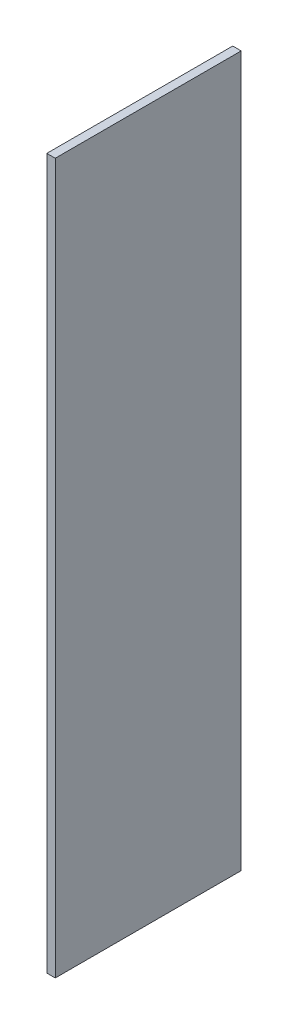
ISO-10303-21;
HEADER;
FILE_DESCRIPTION(('STEP AP214'),'2;1');
FILE_NAME('part.step','',(''),(''),'','','');
FILE_SCHEMA(('AUTOMOTIVE_DESIGN { 1 0 10303 214 1 1 1 1 }'));
ENDSEC;
DATA;
#1=APPLICATION_CONTEXT('core data for automotive mechanical design processes');
#2=APPLICATION_PROTOCOL_DEFINITION('international standard','automotive_design',2000,#1);
#3=PRODUCT_CONTEXT('',#1,'mechanical');
#4=PRODUCT('Part','Part','',(#3));
#5=PRODUCT_RELATED_PRODUCT_CATEGORY('part','',(#4));
#6=PRODUCT_DEFINITION_FORMATION('','',#4);
#7=PRODUCT_DEFINITION_CONTEXT('part definition',#1,'design');
#8=PRODUCT_DEFINITION('design','',#6,#7);
#9=PRODUCT_DEFINITION_SHAPE('','',#8);
#10=(LENGTH_UNIT() NAMED_UNIT(*) SI_UNIT(.MILLI.,.METRE.));
#11=(NAMED_UNIT(*) PLANE_ANGLE_UNIT() SI_UNIT($,.RADIAN.));
#12=(NAMED_UNIT(*) SI_UNIT($,.STERADIAN.) SOLID_ANGLE_UNIT());
#13=UNCERTAINTY_MEASURE_WITH_UNIT(LENGTH_MEASURE(1.E-05),#10,'distance_accuracy_value','');
#14=(GEOMETRIC_REPRESENTATION_CONTEXT(3) GLOBAL_UNCERTAINTY_ASSIGNED_CONTEXT((#13)) GLOBAL_UNIT_ASSIGNED_CONTEXT((#10,
#11,#12)) REPRESENTATION_CONTEXT('',''));
#15=CARTESIAN_POINT('',(0.,0.,0.));
#16=DIRECTION('',(0.,0.,1.));
#17=DIRECTION('',(1.,0.,0.));
#18=AXIS2_PLACEMENT_3D('',#15,#16,#17);
#19=CARTESIAN_POINT('',(12.7,2133.6,279.4));
#20=DIRECTION('',(-1.,0.,0.));
#21=DIRECTION('',(0.,0.,1.));
#22=AXIS2_PLACEMENT_3D('',#19,#20,#21);
#23=PLANE('',#22);
#24=DIRECTION('',(0.,0.,-1.));
#25=VECTOR('',#24,1.);
#26=CARTESIAN_POINT('',(12.7,0.,279.4));
#27=LINE('',#26,#25);
#28=CARTESIAN_POINT('',(12.7,0.,279.4));
#29=VERTEX_POINT('',#28);
#30=CARTESIAN_POINT('',(12.7,0.,-279.4));
#31=VERTEX_POINT('',#30);
#32=EDGE_CURVE('E107',#29,#31,#27,.T.);
#33=ORIENTED_EDGE('',*,*,#32,.T.);
#34=DIRECTION('',(0.,-1.,0.));
#35=VECTOR('',#34,1.);
#36=CARTESIAN_POINT('',(12.7,2133.6,-279.4));
#37=LINE('',#36,#35);
#38=CARTESIAN_POINT('',(12.7,2133.6,-279.4));
#39=VERTEX_POINT('',#38);
#40=EDGE_CURVE('E11',#39,#31,#37,.T.);
#41=ORIENTED_EDGE('',*,*,#40,.F.);
#42=DIRECTION('',(0.,0.,-1.));
#43=VECTOR('',#42,1.);
#44=CARTESIAN_POINT('',(12.7,2133.6,279.4));
#45=LINE('',#44,#43);
#46=CARTESIAN_POINT('',(12.7,2133.6,279.4));
#47=VERTEX_POINT('',#46);
#48=EDGE_CURVE('E91',#47,#39,#45,.T.);
#49=ORIENTED_EDGE('',*,*,#48,.F.);
#50=DIRECTION('',(0.,-1.,0.));
#51=VECTOR('',#50,1.);
#52=CARTESIAN_POINT('',(12.7,2133.6,279.4));
#53=LINE('',#52,#51);
#54=EDGE_CURVE('E103',#47,#29,#53,.T.);
#55=ORIENTED_EDGE('',*,*,#54,.T.);
#56=EDGE_LOOP('',(#33,#41,#49,#55));
#57=FACE_BOUND('',#56,.T.);
#58=ADVANCED_FACE('F39',(#57),#23,.F.);
#59=CARTESIAN_POINT('',(-12.7,2133.6,-279.4));
#60=DIRECTION('',(0.,0.,1.));
#61=DIRECTION('',(1.,0.,0.));
#62=AXIS2_PLACEMENT_3D('',#59,#60,#61);
#63=PLANE('',#62);
#64=DIRECTION('',(-1.,0.,0.));
#65=VECTOR('',#64,1.);
#66=CARTESIAN_POINT('',(-12.7,0.,-279.4));
#67=LINE('',#66,#65);
#68=CARTESIAN_POINT('',(-12.7,0.,-279.4));
#69=VERTEX_POINT('',#68);
#70=EDGE_CURVE('E96',#31,#69,#67,.T.);
#71=ORIENTED_EDGE('',*,*,#70,.T.);
#72=DIRECTION('',(0.,-1.,0.));
#73=VECTOR('',#72,1.);
#74=CARTESIAN_POINT('',(-12.7,2133.6,-279.4));
#75=LINE('',#74,#73);
#76=CARTESIAN_POINT('',(-12.7,2133.6,-279.4));
#77=VERTEX_POINT('',#76);
#78=EDGE_CURVE('E48',#77,#69,#75,.T.);
#79=ORIENTED_EDGE('',*,*,#78,.F.);
#80=DIRECTION('',(-1.,0.,0.));
#81=VECTOR('',#80,1.);
#82=CARTESIAN_POINT('',(-12.7,2133.6,-279.4));
#83=LINE('',#82,#81);
#84=EDGE_CURVE('E86',#39,#77,#83,.T.);
#85=ORIENTED_EDGE('',*,*,#84,.F.);
#86=ORIENTED_EDGE('',*,*,#40,.T.);
#87=EDGE_LOOP('',(#71,#79,#85,#86));
#88=FACE_BOUND('',#87,.T.);
#89=ADVANCED_FACE('F95',(#88),#63,.F.);
#90=CARTESIAN_POINT('',(-12.7,2133.6,279.4));
#91=DIRECTION('',(1.,0.,0.));
#92=DIRECTION('',(0.,0.,-1.));
#93=AXIS2_PLACEMENT_3D('',#90,#91,#92);
#94=PLANE('',#93);
#95=DIRECTION('',(0.,0.,1.));
#96=VECTOR('',#95,1.);
#97=CARTESIAN_POINT('',(-12.7,0.,279.4));
#98=LINE('',#97,#96);
#99=CARTESIAN_POINT('',(-12.7,0.,279.4));
#100=VERTEX_POINT('',#99);
#101=EDGE_CURVE('E73',#69,#100,#98,.T.);
#102=ORIENTED_EDGE('',*,*,#101,.T.);
#103=DIRECTION('',(0.,-1.,0.));
#104=VECTOR('',#103,1.);
#105=CARTESIAN_POINT('',(-12.7,2133.6,279.4));
#106=LINE('',#105,#104);
#107=CARTESIAN_POINT('',(-12.7,2133.6,279.4));
#108=VERTEX_POINT('',#107);
#109=EDGE_CURVE('E98',#108,#100,#106,.T.);
#110=ORIENTED_EDGE('',*,*,#109,.F.);
#111=DIRECTION('',(0.,0.,1.));
#112=VECTOR('',#111,1.);
#113=CARTESIAN_POINT('',(-12.7,2133.6,279.4));
#114=LINE('',#113,#112);
#115=EDGE_CURVE('E89',#77,#108,#114,.T.);
#116=ORIENTED_EDGE('',*,*,#115,.F.);
#117=ORIENTED_EDGE('',*,*,#78,.T.);
#118=EDGE_LOOP('',(#102,#110,#116,#117));
#119=FACE_BOUND('',#118,.T.);
#120=ADVANCED_FACE('F99',(#119),#94,.F.);
#121=CARTESIAN_POINT('',(-12.7,2133.6,279.4));
#122=DIRECTION('',(0.,0.,-1.));
#123=DIRECTION('',(-1.,0.,0.));
#124=AXIS2_PLACEMENT_3D('',#121,#122,#123);
#125=PLANE('',#124);
#126=DIRECTION('',(1.,0.,0.));
#127=VECTOR('',#126,1.);
#128=CARTESIAN_POINT('',(-12.7,0.,279.4));
#129=LINE('',#128,#127);
#130=EDGE_CURVE('E79',#100,#29,#129,.T.);
#131=ORIENTED_EDGE('',*,*,#130,.T.);
#132=ORIENTED_EDGE('',*,*,#54,.F.);
#133=DIRECTION('',(1.,0.,0.));
#134=VECTOR('',#133,1.);
#135=CARTESIAN_POINT('',(-12.7,2133.6,279.4));
#136=LINE('',#135,#134);
#137=EDGE_CURVE('E56',#108,#47,#136,.T.);
#138=ORIENTED_EDGE('',*,*,#137,.F.);
#139=ORIENTED_EDGE('',*,*,#109,.T.);
#140=EDGE_LOOP('',(#131,#132,#138,#139));
#141=FACE_BOUND('',#140,.T.);
#142=ADVANCED_FACE('F120',(#141),#125,.F.);
#143=CARTESIAN_POINT('',(0.,2133.6,0.));
#144=DIRECTION('',(0.,-1.,0.));
#145=DIRECTION('',(0.,0.,-1.));
#146=AXIS2_PLACEMENT_3D('',#143,#144,#145);
#147=PLANE('',#146);
#148=ORIENTED_EDGE('',*,*,#48,.T.);
#149=ORIENTED_EDGE('',*,*,#84,.T.);
#150=ORIENTED_EDGE('',*,*,#115,.T.);
#151=ORIENTED_EDGE('',*,*,#137,.T.);
#152=EDGE_LOOP('',(#148,#149,#150,#151));
#153=FACE_BOUND('',#152,.T.);
#154=ADVANCED_FACE('F87',(#153),#147,.F.);
#155=CARTESIAN_POINT('',(0.,0.,0.));
#156=DIRECTION('',(0.,-1.,0.));
#157=DIRECTION('',(0.,0.,-1.));
#158=AXIS2_PLACEMENT_3D('',#155,#156,#157);
#159=PLANE('',#158);
#160=ORIENTED_EDGE('',*,*,#32,.F.);
#161=ORIENTED_EDGE('',*,*,#130,.F.);
#162=ORIENTED_EDGE('',*,*,#101,.F.);
#163=ORIENTED_EDGE('',*,*,#70,.F.);
#164=EDGE_LOOP('',(#160,#161,#162,#163));
#165=FACE_BOUND('',#164,.T.);
#166=ADVANCED_FACE('F123',(#165),#159,.T.);
#167=CLOSED_SHELL('',(#58,#89,#120,#142,#154,#166));
#168=MANIFOLD_SOLID_BREP('B2',#167);
#169=ADVANCED_BREP_SHAPE_REPRESENTATION('',(#18,#168),#14);
#170=SHAPE_DEFINITION_REPRESENTATION(#9,#169);
ENDSEC;
END-ISO-10303-21;
